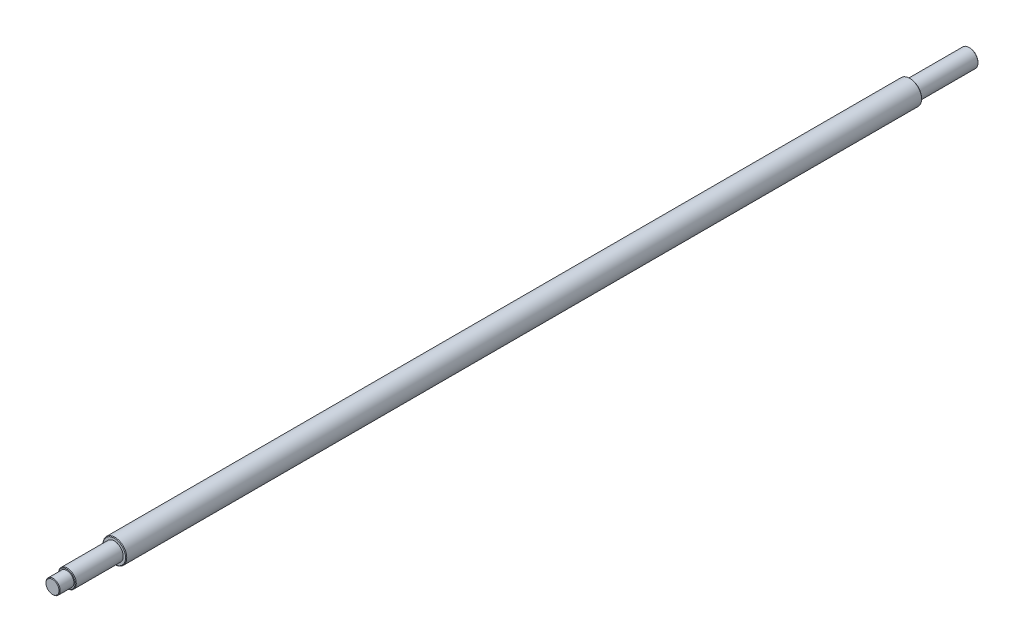
ISO-10303-21;
HEADER;
FILE_DESCRIPTION(('STEP AP214'),'2;1');
FILE_NAME('part.step','',(''),(''),'','','');
FILE_SCHEMA(('AUTOMOTIVE_DESIGN { 1 0 10303 214 1 1 1 1 }'));
ENDSEC;
DATA;
#1=APPLICATION_CONTEXT('core data for automotive mechanical design processes');
#2=APPLICATION_PROTOCOL_DEFINITION('international standard','automotive_design',2000,#1);
#3=PRODUCT_CONTEXT('',#1,'mechanical');
#4=PRODUCT('Part','Part','',(#3));
#5=PRODUCT_RELATED_PRODUCT_CATEGORY('part','',(#4));
#6=PRODUCT_DEFINITION_FORMATION('','',#4);
#7=PRODUCT_DEFINITION_CONTEXT('part definition',#1,'design');
#8=PRODUCT_DEFINITION('design','',#6,#7);
#9=PRODUCT_DEFINITION_SHAPE('','',#8);
#10=(LENGTH_UNIT() NAMED_UNIT(*) SI_UNIT(.MILLI.,.METRE.));
#11=(NAMED_UNIT(*) PLANE_ANGLE_UNIT() SI_UNIT($,.RADIAN.));
#12=(NAMED_UNIT(*) SI_UNIT($,.STERADIAN.) SOLID_ANGLE_UNIT());
#13=UNCERTAINTY_MEASURE_WITH_UNIT(LENGTH_MEASURE(1.E-05),#10,'distance_accuracy_value','');
#14=(GEOMETRIC_REPRESENTATION_CONTEXT(3) GLOBAL_UNCERTAINTY_ASSIGNED_CONTEXT((#13)) GLOBAL_UNIT_ASSIGNED_CONTEXT((#10,
#11,#12)) REPRESENTATION_CONTEXT('',''));
#15=CARTESIAN_POINT('',(0.,0.,0.));
#16=DIRECTION('',(0.,0.,1.));
#17=DIRECTION('',(1.,0.,0.));
#18=AXIS2_PLACEMENT_3D('',#15,#16,#17);
#19=CARTESIAN_POINT('',(0.,0.,335.));
#20=DIRECTION('',(0.,0.,-1.));
#21=DIRECTION('',(-1.,0.,0.));
#22=AXIS2_PLACEMENT_3D('',#19,#20,#21);
#23=CYLINDRICAL_SURFACE('',#22,10.);
#24=CARTESIAN_POINT('',(0.,0.,-334.5));
#25=DIRECTION('',(0.,0.,1.));
#26=DIRECTION('',(1.,0.,0.));
#27=AXIS2_PLACEMENT_3D('',#24,#25,#26);
#28=CIRCLE('',#27,10.);
#29=CARTESIAN_POINT('',(10.,0.,-334.5));
#30=VERTEX_POINT('',#29);
#31=EDGE_CURVE('E64',#30,#30,#28,.T.);
#32=ORIENTED_EDGE('',*,*,#31,.T.);
#33=EDGE_LOOP('',(#32));
#34=FACE_BOUND('',#33,.T.);
#35=CARTESIAN_POINT('',(0.,0.,334.5));
#36=DIRECTION('',(0.,0.,1.));
#37=DIRECTION('',(1.,0.,0.));
#38=AXIS2_PLACEMENT_3D('',#35,#36,#37);
#39=CIRCLE('',#38,10.);
#40=CARTESIAN_POINT('',(10.,0.,334.5));
#41=VERTEX_POINT('',#40);
#42=EDGE_CURVE('E67',#41,#41,#39,.F.);
#43=ORIENTED_EDGE('',*,*,#42,.T.);
#44=EDGE_LOOP('',(#43));
#45=FACE_BOUND('',#44,.T.);
#46=ADVANCED_FACE('F32',(#34,#45),#23,.T.);
#47=CARTESIAN_POINT('',(0.,0.,335.));
#48=DIRECTION('',(0.,0.,1.));
#49=DIRECTION('',(1.,0.,0.));
#50=AXIS2_PLACEMENT_3D('',#47,#48,#49);
#51=PLANE('',#50);
#52=CARTESIAN_POINT('',(0.,0.,335.));
#53=DIRECTION('',(0.,0.,1.));
#54=DIRECTION('',(1.,0.,0.));
#55=AXIS2_PLACEMENT_3D('',#52,#53,#54);
#56=CIRCLE('',#55,9.49999999999995);
#57=CARTESIAN_POINT('',(9.49999999999995,0.,335.));
#58=VERTEX_POINT('',#57);
#59=EDGE_CURVE('E52',#58,#58,#56,.T.);
#60=ORIENTED_EDGE('',*,*,#59,.T.);
#61=EDGE_LOOP('',(#60));
#62=FACE_BOUND('',#61,.T.);
#63=CARTESIAN_POINT('',(0.,0.,335.));
#64=DIRECTION('',(0.,0.,1.));
#65=DIRECTION('',(1.,0.,0.));
#66=AXIS2_PLACEMENT_3D('',#63,#64,#65);
#67=CIRCLE('',#66,7.5);
#68=CARTESIAN_POINT('',(7.5,0.,335.));
#69=VERTEX_POINT('',#68);
#70=EDGE_CURVE('E73',#69,#69,#67,.T.);
#71=ORIENTED_EDGE('',*,*,#70,.F.);
#72=EDGE_LOOP('',(#71));
#73=FACE_BOUND('',#72,.T.);
#74=ADVANCED_FACE('F98',(#62,#73),#51,.T.);
#75=CARTESIAN_POINT('',(0.,0.,-335.));
#76=DIRECTION('',(0.,0.,1.));
#77=DIRECTION('',(1.,0.,0.));
#78=AXIS2_PLACEMENT_3D('',#75,#76,#77);
#79=PLANE('',#78);
#80=CARTESIAN_POINT('',(0.,0.,-335.));
#81=DIRECTION('',(0.,0.,1.));
#82=DIRECTION('',(1.,0.,0.));
#83=AXIS2_PLACEMENT_3D('',#80,#81,#82);
#84=CIRCLE('',#83,9.50000000000006);
#85=CARTESIAN_POINT('',(9.50000000000006,0.,-335.));
#86=VERTEX_POINT('',#85);
#87=EDGE_CURVE('E61',#86,#86,#84,.F.);
#88=ORIENTED_EDGE('',*,*,#87,.T.);
#89=EDGE_LOOP('',(#88));
#90=FACE_BOUND('',#89,.T.);
#91=CARTESIAN_POINT('',(0.,0.,-335.));
#92=DIRECTION('',(0.,0.,1.));
#93=DIRECTION('',(1.,0.,0.));
#94=AXIS2_PLACEMENT_3D('',#91,#92,#93);
#95=CIRCLE('',#94,7.5);
#96=CARTESIAN_POINT('',(7.5,0.,-335.));
#97=VERTEX_POINT('',#96);
#98=EDGE_CURVE('E70',#97,#97,#95,.F.);
#99=ORIENTED_EDGE('',*,*,#98,.F.);
#100=EDGE_LOOP('',(#99));
#101=FACE_BOUND('',#100,.T.);
#102=ADVANCED_FACE('F94',(#90,#101),#79,.F.);
#103=CARTESIAN_POINT('',(0.,0.,375.));
#104=DIRECTION('',(0.,0.,-1.));
#105=DIRECTION('',(-1.,0.,0.));
#106=AXIS2_PLACEMENT_3D('',#103,#104,#105);
#107=CYLINDRICAL_SURFACE('',#106,7.5);
#108=CARTESIAN_POINT('',(0.,0.,374.5));
#109=DIRECTION('',(0.,0.,1.));
#110=DIRECTION('',(1.,0.,0.));
#111=AXIS2_PLACEMENT_3D('',#108,#109,#110);
#112=CIRCLE('',#111,7.5);
#113=CARTESIAN_POINT('',(7.5,0.,374.5));
#114=VERTEX_POINT('',#113);
#115=EDGE_CURVE('E55',#114,#114,#112,.F.);
#116=ORIENTED_EDGE('',*,*,#115,.T.);
#117=EDGE_LOOP('',(#116));
#118=FACE_BOUND('',#117,.T.);
#119=ORIENTED_EDGE('',*,*,#70,.T.);
#120=EDGE_LOOP('',(#119));
#121=FACE_BOUND('',#120,.T.);
#122=ADVANCED_FACE('F84',(#118,#121),#107,.T.);
#123=CARTESIAN_POINT('',(0.,0.,375.));
#124=DIRECTION('',(0.,0.,1.));
#125=DIRECTION('',(1.,0.,0.));
#126=AXIS2_PLACEMENT_3D('',#123,#124,#125);
#127=PLANE('',#126);
#128=CARTESIAN_POINT('',(0.,0.,375.));
#129=DIRECTION('',(0.,0.,1.));
#130=DIRECTION('',(1.,0.,0.));
#131=AXIS2_PLACEMENT_3D('',#128,#129,#130);
#132=CIRCLE('',#131,6.99999999999989);
#133=CARTESIAN_POINT('',(6.99999999999989,0.,375.));
#134=VERTEX_POINT('',#133);
#135=EDGE_CURVE('E58',#134,#134,#132,.T.);
#136=ORIENTED_EDGE('',*,*,#135,.T.);
#137=EDGE_LOOP('',(#136));
#138=FACE_BOUND('',#137,.T.);
#139=CARTESIAN_POINT('',(0.,0.,375.));
#140=DIRECTION('',(0.,0.,1.));
#141=DIRECTION('',(1.,0.,0.));
#142=AXIS2_PLACEMENT_3D('',#139,#140,#141);
#143=CIRCLE('',#142,6.);
#144=CARTESIAN_POINT('',(6.,0.,375.));
#145=VERTEX_POINT('',#144);
#146=EDGE_CURVE('E76',#145,#145,#143,.T.);
#147=ORIENTED_EDGE('',*,*,#146,.F.);
#148=EDGE_LOOP('',(#147));
#149=FACE_BOUND('',#148,.T.);
#150=ADVANCED_FACE('F82',(#138,#149),#127,.T.);
#151=CARTESIAN_POINT('',(0.,0.,387.));
#152=DIRECTION('',(0.,0.,-1.));
#153=DIRECTION('',(-1.,0.,0.));
#154=AXIS2_PLACEMENT_3D('',#151,#152,#153);
#155=CYLINDRICAL_SURFACE('',#154,6.);
#156=CARTESIAN_POINT('',(0.,0.,386.5));
#157=DIRECTION('',(0.,0.,1.));
#158=DIRECTION('',(1.,0.,0.));
#159=AXIS2_PLACEMENT_3D('',#156,#157,#158);
#160=CIRCLE('',#159,6.);
#161=CARTESIAN_POINT('',(6.,0.,386.5));
#162=VERTEX_POINT('',#161);
#163=EDGE_CURVE('E43',#162,#162,#160,.F.);
#164=ORIENTED_EDGE('',*,*,#163,.T.);
#165=EDGE_LOOP('',(#164));
#166=FACE_BOUND('',#165,.T.);
#167=ORIENTED_EDGE('',*,*,#146,.T.);
#168=EDGE_LOOP('',(#167));
#169=FACE_BOUND('',#168,.T.);
#170=ADVANCED_FACE('F80',(#166,#169),#155,.T.);
#171=CARTESIAN_POINT('',(0.,0.,387.));
#172=DIRECTION('',(0.,0.,1.));
#173=DIRECTION('',(1.,0.,0.));
#174=AXIS2_PLACEMENT_3D('',#171,#172,#173);
#175=PLANE('',#174);
#176=CARTESIAN_POINT('',(0.,0.,387.));
#177=DIRECTION('',(0.,0.,1.));
#178=DIRECTION('',(1.,0.,0.));
#179=AXIS2_PLACEMENT_3D('',#176,#177,#178);
#180=CIRCLE('',#179,5.50000000000017);
#181=CARTESIAN_POINT('',(5.50000000000017,0.,387.));
#182=VERTEX_POINT('',#181);
#183=EDGE_CURVE('E47',#182,#182,#180,.T.);
#184=ORIENTED_EDGE('',*,*,#183,.T.);
#185=EDGE_LOOP('',(#184));
#186=FACE_BOUND('',#185,.T.);
#187=ADVANCED_FACE('F91',(#186),#175,.T.);
#188=CARTESIAN_POINT('',(0.,0.,-385.));
#189=DIRECTION('',(0.,0.,1.));
#190=DIRECTION('',(1.,0.,0.));
#191=AXIS2_PLACEMENT_3D('',#188,#189,#190);
#192=CYLINDRICAL_SURFACE('',#191,7.5);
#193=CARTESIAN_POINT('',(0.,0.,-384.5));
#194=DIRECTION('',(0.,0.,-1.));
#195=DIRECTION('',(-1.,0.,0.));
#196=AXIS2_PLACEMENT_3D('',#193,#194,#195);
#197=CIRCLE('',#196,7.5);
#198=CARTESIAN_POINT('',(-7.5,0.,-384.5));
#199=VERTEX_POINT('',#198);
#200=EDGE_CURVE('E10',#199,#199,#197,.F.);
#201=ORIENTED_EDGE('',*,*,#200,.T.);
#202=EDGE_LOOP('',(#201));
#203=FACE_BOUND('',#202,.T.);
#204=ORIENTED_EDGE('',*,*,#98,.T.);
#205=EDGE_LOOP('',(#204));
#206=FACE_BOUND('',#205,.T.);
#207=ADVANCED_FACE('F133',(#203,#206),#192,.T.);
#208=CARTESIAN_POINT('',(0.,0.,-385.));
#209=DIRECTION('',(0.,0.,-1.));
#210=DIRECTION('',(-1.,0.,0.));
#211=AXIS2_PLACEMENT_3D('',#208,#209,#210);
#212=PLANE('',#211);
#213=CARTESIAN_POINT('',(0.,0.,-385.));
#214=DIRECTION('',(0.,0.,-1.));
#215=DIRECTION('',(-1.,0.,0.));
#216=AXIS2_PLACEMENT_3D('',#213,#214,#215);
#217=CIRCLE('',#216,6.99999999999989);
#218=CARTESIAN_POINT('',(-6.99999999999989,0.,-385.));
#219=VERTEX_POINT('',#218);
#220=EDGE_CURVE('E39',#219,#219,#217,.T.);
#221=ORIENTED_EDGE('',*,*,#220,.T.);
#222=EDGE_LOOP('',(#221));
#223=FACE_BOUND('',#222,.T.);
#224=ADVANCED_FACE('F113',(#223),#212,.T.);
#225=CARTESIAN_POINT('',(0.,0.,-334.5));
#226=DIRECTION('',(0.,0.,1.));
#227=DIRECTION('',(1.,0.,0.));
#228=AXIS2_PLACEMENT_3D('',#225,#226,#227);
#229=CONICAL_SURFACE('',#228,10.,0.78539816339744);
#230=ORIENTED_EDGE('',*,*,#87,.F.);
#231=EDGE_LOOP('',(#230));
#232=FACE_BOUND('',#231,.T.);
#233=ORIENTED_EDGE('',*,*,#31,.F.);
#234=EDGE_LOOP('',(#233));
#235=FACE_BOUND('',#234,.T.);
#236=ADVANCED_FACE('F109',(#232,#235),#229,.T.);
#237=CARTESIAN_POINT('',(0.,0.,375.));
#238=DIRECTION('',(0.,0.,-1.));
#239=DIRECTION('',(-1.,0.,0.));
#240=AXIS2_PLACEMENT_3D('',#237,#238,#239);
#241=CONICAL_SURFACE('',#240,6.99999999999989,0.785398163397442);
#242=ORIENTED_EDGE('',*,*,#115,.F.);
#243=EDGE_LOOP('',(#242));
#244=FACE_BOUND('',#243,.T.);
#245=ORIENTED_EDGE('',*,*,#135,.F.);
#246=EDGE_LOOP('',(#245));
#247=FACE_BOUND('',#246,.T.);
#248=ADVANCED_FACE('F112',(#244,#247),#241,.T.);
#249=CARTESIAN_POINT('',(0.,0.,335.));
#250=DIRECTION('',(0.,0.,-1.));
#251=DIRECTION('',(-1.,0.,0.));
#252=AXIS2_PLACEMENT_3D('',#249,#250,#251);
#253=CONICAL_SURFACE('',#252,9.49999999999995,0.78539816339744);
#254=ORIENTED_EDGE('',*,*,#42,.F.);
#255=EDGE_LOOP('',(#254));
#256=FACE_BOUND('',#255,.T.);
#257=ORIENTED_EDGE('',*,*,#59,.F.);
#258=EDGE_LOOP('',(#257));
#259=FACE_BOUND('',#258,.T.);
#260=ADVANCED_FACE('F117',(#256,#259),#253,.T.);
#261=CARTESIAN_POINT('',(0.,0.,387.));
#262=DIRECTION('',(0.,0.,-1.));
#263=DIRECTION('',(-1.,0.,0.));
#264=AXIS2_PLACEMENT_3D('',#261,#262,#263);
#265=CONICAL_SURFACE('',#264,5.50000000000017,0.785398163397444);
#266=ORIENTED_EDGE('',*,*,#163,.F.);
#267=EDGE_LOOP('',(#266));
#268=FACE_BOUND('',#267,.T.);
#269=ORIENTED_EDGE('',*,*,#183,.F.);
#270=EDGE_LOOP('',(#269));
#271=FACE_BOUND('',#270,.T.);
#272=ADVANCED_FACE('F120',(#268,#271),#265,.T.);
#273=CARTESIAN_POINT('',(0.,0.,-385.));
#274=DIRECTION('',(0.,0.,1.));
#275=DIRECTION('',(1.,0.,0.));
#276=AXIS2_PLACEMENT_3D('',#273,#274,#275);
#277=CONICAL_SURFACE('',#276,6.99999999999989,0.785398163397442);
#278=ORIENTED_EDGE('',*,*,#200,.F.);
#279=EDGE_LOOP('',(#278));
#280=FACE_BOUND('',#279,.T.);
#281=ORIENTED_EDGE('',*,*,#220,.F.);
#282=EDGE_LOOP('',(#281));
#283=FACE_BOUND('',#282,.T.);
#284=ADVANCED_FACE('F34',(#280,#283),#277,.T.);
#285=CLOSED_SHELL('',(#46,#74,#102,#122,#150,#170,#187,#207,#224,#236,#248,#260,#272,#284));
#286=MANIFOLD_SOLID_BREP('B2',#285);
#287=ADVANCED_BREP_SHAPE_REPRESENTATION('',(#18,#286),#14);
#288=SHAPE_DEFINITION_REPRESENTATION(#9,#287);
ENDSEC;
END-ISO-10303-21;
